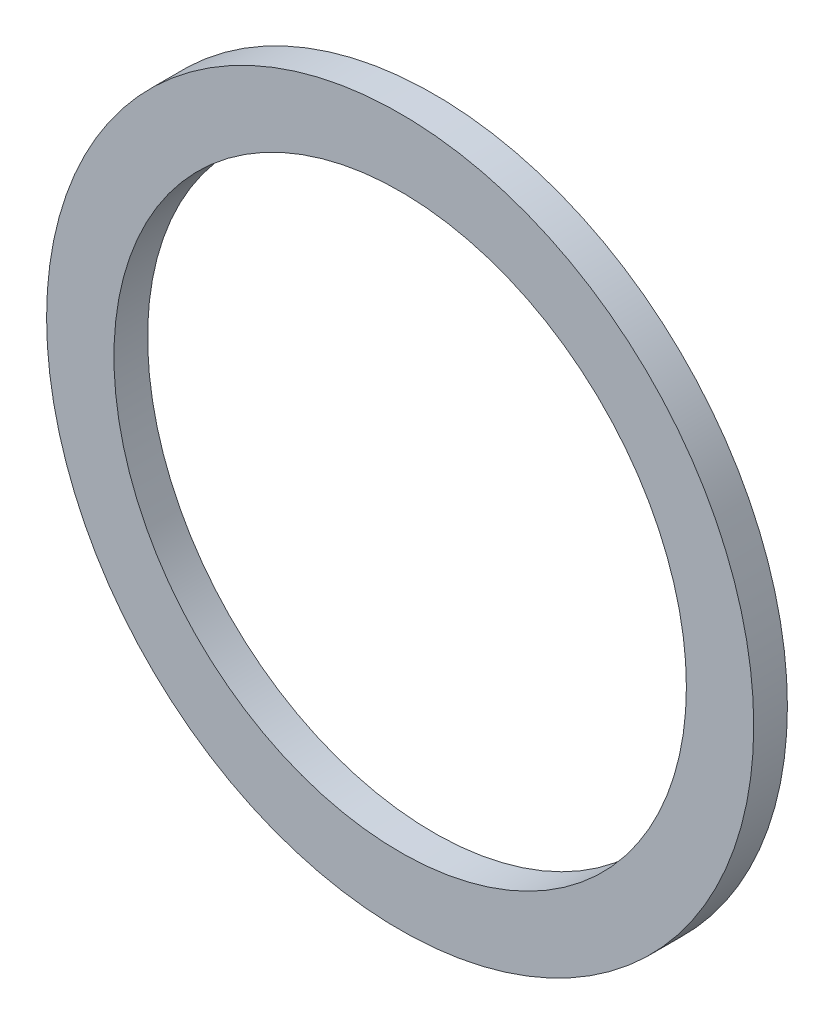
ISO-10303-21;
HEADER;
FILE_DESCRIPTION(('STEP AP214'),'2;1');
FILE_NAME('part.step','',(''),(''),'','','');
FILE_SCHEMA(('AUTOMOTIVE_DESIGN { 1 0 10303 214 1 1 1 1 }'));
ENDSEC;
DATA;
#1=APPLICATION_CONTEXT('core data for automotive mechanical design processes');
#2=APPLICATION_PROTOCOL_DEFINITION('international standard','automotive_design',2000,#1);
#3=PRODUCT_CONTEXT('',#1,'mechanical');
#4=PRODUCT('Part','Part','',(#3));
#5=PRODUCT_RELATED_PRODUCT_CATEGORY('part','',(#4));
#6=PRODUCT_DEFINITION_FORMATION('','',#4);
#7=PRODUCT_DEFINITION_CONTEXT('part definition',#1,'design');
#8=PRODUCT_DEFINITION('design','',#6,#7);
#9=PRODUCT_DEFINITION_SHAPE('','',#8);
#10=(LENGTH_UNIT() NAMED_UNIT(*) SI_UNIT(.MILLI.,.METRE.));
#11=(NAMED_UNIT(*) PLANE_ANGLE_UNIT() SI_UNIT($,.RADIAN.));
#12=(NAMED_UNIT(*) SI_UNIT($,.STERADIAN.) SOLID_ANGLE_UNIT());
#13=UNCERTAINTY_MEASURE_WITH_UNIT(LENGTH_MEASURE(1.E-05),#10,'distance_accuracy_value','');
#14=(GEOMETRIC_REPRESENTATION_CONTEXT(3) GLOBAL_UNCERTAINTY_ASSIGNED_CONTEXT((#13)) GLOBAL_UNIT_ASSIGNED_CONTEXT((#10,
#11,#12)) REPRESENTATION_CONTEXT('',''));
#15=CARTESIAN_POINT('',(0.,0.,0.));
#16=DIRECTION('',(0.,0.,1.));
#17=DIRECTION('',(1.,0.,0.));
#18=AXIS2_PLACEMENT_3D('',#15,#16,#17);
#19=CARTESIAN_POINT('',(0.,0.,2.));
#20=DIRECTION('',(0.,0.,1.));
#21=DIRECTION('',(1.,0.,0.));
#22=AXIS2_PLACEMENT_3D('',#19,#20,#21);
#23=PLANE('',#22);
#24=CARTESIAN_POINT('',(0.,0.,2.));
#25=DIRECTION('',(0.,0.,1.));
#26=DIRECTION('',(1.,0.,0.));
#27=AXIS2_PLACEMENT_3D('',#24,#25,#26);
#28=CIRCLE('',#27,21.);
#29=CARTESIAN_POINT('',(21.,0.,2.));
#30=VERTEX_POINT('',#29);
#31=EDGE_CURVE('E10',#30,#30,#28,.T.);
#32=ORIENTED_EDGE('',*,*,#31,.T.);
#33=EDGE_LOOP('',(#32));
#34=FACE_BOUND('',#33,.T.);
#35=CARTESIAN_POINT('',(0.,0.,2.));
#36=DIRECTION('',(0.,0.,1.));
#37=DIRECTION('',(1.,0.,0.));
#38=AXIS2_PLACEMENT_3D('',#35,#36,#37);
#39=CIRCLE('',#38,17.);
#40=CARTESIAN_POINT('',(17.,0.,2.));
#41=VERTEX_POINT('',#40);
#42=EDGE_CURVE('E45',#41,#41,#39,.T.);
#43=ORIENTED_EDGE('',*,*,#42,.F.);
#44=EDGE_LOOP('',(#43));
#45=FACE_BOUND('',#44,.T.);
#46=ADVANCED_FACE('F34',(#34,#45),#23,.T.);
#47=CARTESIAN_POINT('',(0.,0.,0.));
#48=DIRECTION('',(0.,0.,1.));
#49=DIRECTION('',(1.,0.,0.));
#50=AXIS2_PLACEMENT_3D('',#47,#48,#49);
#51=PLANE('',#50);
#52=CARTESIAN_POINT('',(0.,0.,0.));
#53=DIRECTION('',(0.,0.,1.));
#54=DIRECTION('',(1.,0.,0.));
#55=AXIS2_PLACEMENT_3D('',#52,#53,#54);
#56=CIRCLE('',#55,21.);
#57=CARTESIAN_POINT('',(21.,0.,0.));
#58=VERTEX_POINT('',#57);
#59=EDGE_CURVE('E38',#58,#58,#56,.T.);
#60=ORIENTED_EDGE('',*,*,#59,.F.);
#61=EDGE_LOOP('',(#60));
#62=FACE_BOUND('',#61,.T.);
#63=CARTESIAN_POINT('',(0.,0.,0.));
#64=DIRECTION('',(0.,0.,1.));
#65=DIRECTION('',(1.,0.,0.));
#66=AXIS2_PLACEMENT_3D('',#63,#64,#65);
#67=CIRCLE('',#66,17.);
#68=CARTESIAN_POINT('',(17.,0.,0.));
#69=VERTEX_POINT('',#68);
#70=EDGE_CURVE('E47',#69,#69,#67,.T.);
#71=ORIENTED_EDGE('',*,*,#70,.T.);
#72=EDGE_LOOP('',(#71));
#73=FACE_BOUND('',#72,.T.);
#74=ADVANCED_FACE('F57',(#62,#73),#51,.F.);
#75=CARTESIAN_POINT('',(0.,0.,2.));
#76=DIRECTION('',(0.,0.,-1.));
#77=DIRECTION('',(-1.,0.,0.));
#78=AXIS2_PLACEMENT_3D('',#75,#76,#77);
#79=CYLINDRICAL_SURFACE('',#78,21.);
#80=ORIENTED_EDGE('',*,*,#31,.F.);
#81=EDGE_LOOP('',(#80));
#82=FACE_BOUND('',#81,.T.);
#83=ORIENTED_EDGE('',*,*,#59,.T.);
#84=EDGE_LOOP('',(#83));
#85=FACE_BOUND('',#84,.T.);
#86=ADVANCED_FACE('F36',(#82,#85),#79,.T.);
#87=CARTESIAN_POINT('',(0.,0.,2.));
#88=DIRECTION('',(0.,0.,-1.));
#89=DIRECTION('',(-1.,0.,0.));
#90=AXIS2_PLACEMENT_3D('',#87,#88,#89);
#91=CYLINDRICAL_SURFACE('',#90,17.);
#92=ORIENTED_EDGE('',*,*,#42,.T.);
#93=EDGE_LOOP('',(#92));
#94=FACE_BOUND('',#93,.T.);
#95=ORIENTED_EDGE('',*,*,#70,.F.);
#96=EDGE_LOOP('',(#95));
#97=FACE_BOUND('',#96,.T.);
#98=ADVANCED_FACE('F53',(#94,#97),#91,.F.);
#99=CLOSED_SHELL('',(#46,#74,#86,#98));
#100=MANIFOLD_SOLID_BREP('B2',#99);
#101=ADVANCED_BREP_SHAPE_REPRESENTATION('',(#18,#100),#14);
#102=SHAPE_DEFINITION_REPRESENTATION(#9,#101);
ENDSEC;
END-ISO-10303-21;
